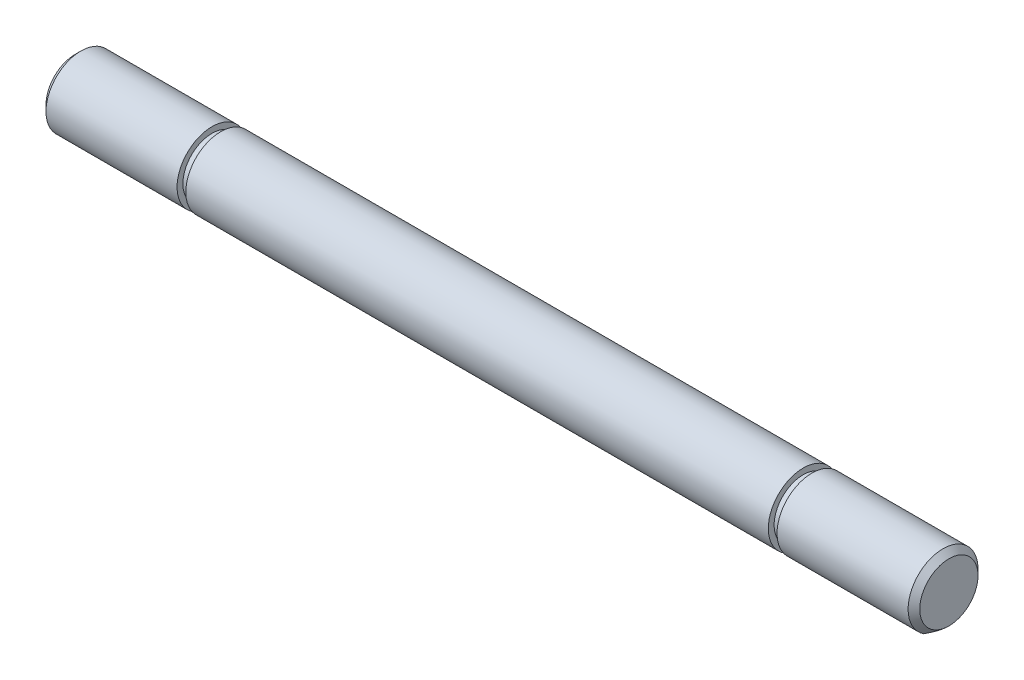
ISO-10303-21;
HEADER;
FILE_DESCRIPTION(('STEP AP214'),'2;1');
FILE_NAME('part.step','',(''),(''),'','','');
FILE_SCHEMA(('AUTOMOTIVE_DESIGN { 1 0 10303 214 1 1 1 1 }'));
ENDSEC;
DATA;
#1=APPLICATION_CONTEXT('core data for automotive mechanical design processes');
#2=APPLICATION_PROTOCOL_DEFINITION('international standard','automotive_design',2000,#1);
#3=PRODUCT_CONTEXT('',#1,'mechanical');
#4=PRODUCT('Part','Part','',(#3));
#5=PRODUCT_RELATED_PRODUCT_CATEGORY('part','',(#4));
#6=PRODUCT_DEFINITION_FORMATION('','',#4);
#7=PRODUCT_DEFINITION_CONTEXT('part definition',#1,'design');
#8=PRODUCT_DEFINITION('design','',#6,#7);
#9=PRODUCT_DEFINITION_SHAPE('','',#8);
#10=(LENGTH_UNIT() NAMED_UNIT(*) SI_UNIT(.MILLI.,.METRE.));
#11=(NAMED_UNIT(*) PLANE_ANGLE_UNIT() SI_UNIT($,.RADIAN.));
#12=(NAMED_UNIT(*) SI_UNIT($,.STERADIAN.) SOLID_ANGLE_UNIT());
#13=UNCERTAINTY_MEASURE_WITH_UNIT(LENGTH_MEASURE(1.E-05),#10,'distance_accuracy_value','');
#14=(GEOMETRIC_REPRESENTATION_CONTEXT(3) GLOBAL_UNCERTAINTY_ASSIGNED_CONTEXT((#13)) GLOBAL_UNIT_ASSIGNED_CONTEXT((#10,
#11,#12)) REPRESENTATION_CONTEXT('',''));
#15=CARTESIAN_POINT('',(0.,0.,0.));
#16=DIRECTION('',(0.,0.,1.));
#17=DIRECTION('',(1.,0.,0.));
#18=AXIS2_PLACEMENT_3D('',#15,#16,#17);
#19=CARTESIAN_POINT('',(75.,1.25000000000002,0.));
#20=DIRECTION('',(1.,0.,0.));
#21=DIRECTION('',(0.,0.,-1.));
#22=AXIS2_PLACEMENT_3D('',#19,#20,#21);
#23=PLANE('',#22);
#24=CARTESIAN_POINT('',(75.0000000001592,0.,0.));
#25=DIRECTION('',(-1.,0.,0.));
#26=DIRECTION('',(0.,0.,1.));
#27=AXIS2_PLACEMENT_3D('',#24,#25,#26);
#28=CIRCLE('',#27,2.50000000022508);
#29=CARTESIAN_POINT('',(75.0000000002717,-2.49999999999999,0.));
#30=VERTEX_POINT('',#29);
#31=EDGE_CURVE('E20',#30,#30,#28,.T.);
#32=ORIENTED_EDGE('',*,*,#31,.F.);
#33=EDGE_LOOP('',(#32));
#34=FACE_BOUND('',#33,.T.);
#35=ADVANCED_FACE('F17',(#34),#23,.T.);
#36=CARTESIAN_POINT('',(0.,1.25,0.));
#37=DIRECTION('',(-1.,0.,0.));
#38=DIRECTION('',(0.,0.,1.));
#39=AXIS2_PLACEMENT_3D('',#36,#37,#38);
#40=PLANE('',#39);
#41=CARTESIAN_POINT('',(-2.27373241762363E-10,0.,0.));
#42=DIRECTION('',(1.,0.,0.));
#43=DIRECTION('',(0.,1.,0.));
#44=AXIS2_PLACEMENT_3D('',#41,#42,#43);
#45=CIRCLE('',#44,2.5000000002251);
#46=CARTESIAN_POINT('',(-3.39924793578909E-10,-2.5,0.));
#47=VERTEX_POINT('',#46);
#48=EDGE_CURVE('E172',#47,#47,#45,.T.);
#49=ORIENTED_EDGE('',*,*,#48,.F.);
#50=EDGE_LOOP('',(#49));
#51=FACE_BOUND('',#50,.T.);
#52=ADVANCED_FACE('F287',(#51),#40,.T.);
#53=CARTESIAN_POINT('',(74.4999999997162,0.,0.));
#54=DIRECTION('',(-1.,0.,0.));
#55=DIRECTION('',(0.,0.,1.));
#56=AXIS2_PLACEMENT_3D('',#53,#54,#55);
#57=CONICAL_SURFACE('',#56,2.99999999981535,0.785398162544797);
#58=CARTESIAN_POINT('',(75.0000000003777,-2.49999999998421,0.));
#59=CARTESIAN_POINT('',(75.0000643180199,-2.49999999999433,-0.0768428390650394));
#60=CARTESIAN_POINT('',(74.9964585673021,-2.49999999999848,-0.153646619209573));
#61=CARTESIAN_POINT('',(74.9824138190233,-2.5000000000015,-0.306486913529822));
#62=CARTESIAN_POINT('',(74.9719877570996,-2.50000000000039,-0.382524604039087));
#63=CARTESIAN_POINT('',(74.9450231890718,-2.4999999999996,-0.532231200794343));
#64=CARTESIAN_POINT('',(74.9285851353344,-2.49999999999989,-0.605918542097343));
#65=CARTESIAN_POINT('',(74.8903277701731,-2.5000000000001,-0.751897161962571));
#66=CARTESIAN_POINT('',(74.8685063607689,-2.50000000000002,-0.824187884367823));
#67=CARTESIAN_POINT('',(74.822241707104,-2.49999999999997,-0.961361203300854));
#68=CARTESIAN_POINT('',(74.7981581625811,-2.49999999999999,-1.02636662471192));
#69=CARTESIAN_POINT('',(74.746697199588,-2.5,-1.1550556226088));
#70=CARTESIAN_POINT('',(74.7193196401627,-2.49999999999999,-1.21873914239197));
#71=CARTESIAN_POINT('',(74.6613450462086,-2.49999999999999,-1.34581350936637));
#72=CARTESIAN_POINT('',(74.6307045192634,-2.49999999999999,-1.40918435906754));
#73=CARTESIAN_POINT('',(74.5670350359512,-2.49999999999999,-1.5346611356597));
#74=CARTESIAN_POINT('',(74.5340077941687,-2.49999999999999,-1.59676793032073));
#75=CARTESIAN_POINT('',(74.4999999996368,-2.49999999999999,-1.65831239498743));
#76=B_SPLINE_CURVE_WITH_KNOTS('',3,(#58,#59,#60,#61,#62,#63,#64,#65,#66,#67,#68,#69,#70,#71,#72,
#73,#74,#75),.UNSPECIFIED.,.F.,.F.,(4,2,2,2,2,2,2,2,4),(0.,0.230381722368763,0.4603277567669,
0.686595218663642,0.912951000314749,1.1208193566158,1.32869661102922,1.53981070673847,
1.75077462031785),.UNSPECIFIED.);
#77=CARTESIAN_POINT('',(74.4999999998206,-2.49999999999999,-1.65831239507852));
#78=VERTEX_POINT('',#77);
#79=EDGE_CURVE('E73',#30,#78,#76,.T.);
#80=ORIENTED_EDGE('',*,*,#79,.T.);
#81=CARTESIAN_POINT('',(74.5,0.,0.));
#82=DIRECTION('',(1.,0.,0.));
#83=DIRECTION('',(0.,1.,0.));
#84=AXIS2_PLACEMENT_3D('',#81,#82,#83);
#85=CIRCLE('',#84,3.);
#86=CARTESIAN_POINT('',(74.4999999998206,-2.49999999999999,1.65831239507852));
#87=VERTEX_POINT('',#86);
#88=EDGE_CURVE('E78',#87,#78,#85,.F.);
#89=ORIENTED_EDGE('',*,*,#88,.F.);
#90=CARTESIAN_POINT('',(74.4999999996856,-2.5000000000998,1.6583123950039));
#91=CARTESIAN_POINT('',(74.5250200252538,-2.50000000003678,1.61304419057546));
#92=CARTESIAN_POINT('',(74.5494994268891,-2.50000000001007,1.56747781741814));
#93=CARTESIAN_POINT('',(74.5972096864187,-2.49999999998992,1.47571363155556));
#94=CARTESIAN_POINT('',(74.6204409035835,-2.49999999999648,1.42951600540109));
#95=CARTESIAN_POINT('',(74.6882337412242,-2.50000000000706,1.28946898271668));
#96=CARTESIAN_POINT('',(74.7306685532871,-2.50000000000186,1.19456817327001));
#97=CARTESIAN_POINT('',(74.8071641312183,-2.49999999999817,1.00435832712285));
#98=CARTESIAN_POINT('',(74.8414185931375,-2.49999999999951,0.909128167468527));
#99=CARTESIAN_POINT('',(74.901118638336,-2.50000000000048,0.715960997208867));
#100=CARTESIAN_POINT('',(74.9265705213433,-2.50000000000011,0.618025976817734));
#101=CARTESIAN_POINT('',(74.9639514163235,-2.49999999999989,0.43409653187828));
#102=CARTESIAN_POINT('',(74.9772928995877,-2.49999999999997,0.348395132601303));
#103=CARTESIAN_POINT('',(74.9908266546624,-2.5,0.218706233403878));
#104=CARTESIAN_POINT('',(74.9942588209172,-2.5,0.175042275234496));
#105=CARTESIAN_POINT('',(74.9988484551189,-2.49999999999999,0.0875881851967177));
#106=CARTESIAN_POINT('',(75.0000055505908,-2.49999999999998,0.0437980338430385));
#107=CARTESIAN_POINT('',(75.0000000003842,-2.49999999999999,1.32850111145839E-12));
#108=B_SPLINE_CURVE_WITH_KNOTS('',3,(#90,#91,#92,#93,#94,#95,#96,#97,#98,#99,#100,#101,#102,
#103,#104,#105,#106,#107),.UNSPECIFIED.,.F.,.F.,(4,2,2,2,2,2,2,2,4),(0.,0.155160114543342,
0.310275326718227,0.621889186997947,0.925164564596093,1.22822244625419,1.48798349608569,
1.61932602429203,1.75069005414115),.UNSPECIFIED.);
#109=EDGE_CURVE('E82',#87,#30,#108,.T.);
#110=ORIENTED_EDGE('',*,*,#109,.T.);
#111=ORIENTED_EDGE('',*,*,#31,.T.);
#112=EDGE_LOOP('',(#80,#89,#110,#111));
#113=FACE_BOUND('',#112,.T.);
#114=ADVANCED_FACE('F75',(#113),#57,.T.);
#115=CARTESIAN_POINT('',(64.75,-2.49999999999999,1.65831239517768));
#116=DIRECTION('',(0.,1.,0.));
#117=DIRECTION('',(0.,0.,1.));
#118=AXIS2_PLACEMENT_3D('',#115,#116,#117);
#119=PLANE('',#118);
#120=DIRECTION('',(1.,0.,0.));
#121=VECTOR('',#120,1.);
#122=CARTESIAN_POINT('',(68.875,-2.49999999999999,1.65831239517768));
#123=LINE('',#122,#121);
#124=CARTESIAN_POINT('',(64.75,-2.49999999999999,1.65831239517768));
#125=VERTEX_POINT('',#124);
#126=EDGE_CURVE('E94',#125,#87,#123,.T.);
#127=ORIENTED_EDGE('',*,*,#126,.F.);
#128=DIRECTION('',(0.,0.,-1.));
#129=VECTOR('',#128,1.);
#130=CARTESIAN_POINT('',(64.75,-2.49999999999999,0.));
#131=LINE('',#130,#129);
#132=CARTESIAN_POINT('',(64.75,-2.49999999999999,-1.65831239517768));
#133=VERTEX_POINT('',#132);
#134=EDGE_CURVE('E87',#133,#125,#131,.F.);
#135=ORIENTED_EDGE('',*,*,#134,.F.);
#136=DIRECTION('',(1.,0.,0.));
#137=VECTOR('',#136,1.);
#138=CARTESIAN_POINT('',(68.875,-2.49999999999999,-1.65831239517768));
#139=LINE('',#138,#137);
#140=EDGE_CURVE('E84',#78,#133,#139,.F.);
#141=ORIENTED_EDGE('',*,*,#140,.F.);
#142=ORIENTED_EDGE('',*,*,#79,.F.);
#143=ORIENTED_EDGE('',*,*,#109,.F.);
#144=EDGE_LOOP('',(#127,#135,#141,#142,#143));
#145=FACE_BOUND('',#144,.T.);
#146=ADVANCED_FACE('F85',(#145),#119,.F.);
#147=CARTESIAN_POINT('',(64.75,-2.65347891346476,0.));
#148=DIRECTION('',(1.,0.,0.));
#149=DIRECTION('',(0.,0.,-1.));
#150=AXIS2_PLACEMENT_3D('',#147,#148,#149);
#151=PLANE('',#150);
#152=ORIENTED_EDGE('',*,*,#134,.T.);
#153=CARTESIAN_POINT('',(64.75,0.,0.));
#154=DIRECTION('',(1.,0.,0.));
#155=DIRECTION('',(0.,1.,0.));
#156=AXIS2_PLACEMENT_3D('',#153,#154,#155);
#157=CIRCLE('',#156,3.);
#158=EDGE_CURVE('E91',#133,#125,#157,.F.);
#159=ORIENTED_EDGE('',*,*,#158,.F.);
#160=EDGE_LOOP('',(#152,#159));
#161=FACE_BOUND('',#160,.T.);
#162=ADVANCED_FACE('F154',(#161),#151,.T.);
#163=CARTESIAN_POINT('',(0.500000000158708,0.,0.));
#164=DIRECTION('',(1.,0.,0.));
#165=DIRECTION('',(0.,1.,0.));
#166=AXIS2_PLACEMENT_3D('',#163,#164,#165);
#167=CONICAL_SURFACE('',#166,2.99999999970169,0.785398162487953);
#168=CARTESIAN_POINT('',(-4.42714658253282E-10,-2.49999999997643,0.));
#169=CARTESIAN_POINT('',(-6.43180869622326E-05,-2.49999999999154,0.0768428390574871));
#170=CARTESIAN_POINT('',(0.00354143262968951,-2.49999999999773,0.153646619194417));
#171=CARTESIAN_POINT('',(0.0175861809067086,-2.50000000000225,0.306486913499419));
#172=CARTESIAN_POINT('',(0.0280122428296728,-2.5000000000006,0.382524604001039));
#173=CARTESIAN_POINT('',(0.0549768108553982,-2.4999999999994,0.532231200741025));
#174=CARTESIAN_POINT('',(0.0714148645913386,-2.49999999999984,0.605918542036402));
#175=CARTESIAN_POINT('',(0.109672229749392,-2.50000000000015,0.751897161886475));
#176=CARTESIAN_POINT('',(0.131493639151768,-2.50000000000004,0.824187884284196));
#177=CARTESIAN_POINT('',(0.177758292818269,-2.49999999999996,0.961361203218611));
#178=CARTESIAN_POINT('',(0.201841837345438,-2.49999999999999,1.02636662463827));
#179=CARTESIAN_POINT('',(0.253302800348481,-2.50000000000001,1.15505562255175));
#180=CARTESIAN_POINT('',(0.280680359779371,-2.5,1.21873914234292));
#181=CARTESIAN_POINT('',(0.338654953745804,-2.49999999999999,1.34581350933328));
#182=CARTESIAN_POINT('',(0.369295480697829,-2.49999999999999,1.40918435904239));
#183=CARTESIAN_POINT('',(0.432964964024455,-2.5,1.53466113564985));
#184=CARTESIAN_POINT('',(0.465992205814622,-2.5,1.59676793031824));
#185=CARTESIAN_POINT('',(0.500000000354411,-2.5,1.65831239499208));
#186=B_SPLINE_CURVE_WITH_KNOTS('',3,(#168,#169,#170,#171,#172,#173,#174,#175,#176,#177,#178,
#179,#180,#181,#182,#183,#184,#185),.UNSPECIFIED.,.F.,.F.,(4,2,2,2,2,2,2,2,4),(0.,
0.230381722345836,0.460327756720946,0.686595218594446,0.912951000222368,1.12081935655201,
1.32869661099407,1.53981070673365,1.75077462034321),.UNSPECIFIED.);
#187=CARTESIAN_POINT('',(0.500000000175033,-2.5,1.65831239508096));
#188=VERTEX_POINT('',#187);
#189=EDGE_CURVE('E142',#47,#188,#186,.T.);
#190=ORIENTED_EDGE('',*,*,#189,.T.);
#191=CARTESIAN_POINT('',(0.500000000000004,0.,0.));
#192=DIRECTION('',(1.,0.,0.));
#193=DIRECTION('',(0.,1.,0.));
#194=AXIS2_PLACEMENT_3D('',#191,#192,#193);
#195=CIRCLE('',#194,3.);
#196=CARTESIAN_POINT('',(0.500000000175033,-2.5,-1.65831239508096));
#197=VERTEX_POINT('',#196);
#198=EDGE_CURVE('E177',#197,#188,#195,.T.);
#199=ORIENTED_EDGE('',*,*,#198,.F.);
#200=CARTESIAN_POINT('',(0.500000000306733,-2.50000000009738,-1.65831239500816));
#201=CARTESIAN_POINT('',(0.474979974736805,-2.50000000003588,-1.6130441905833));
#202=CARTESIAN_POINT('',(0.450500573099985,-2.50000000000982,-1.56747781742935));
#203=CARTESIAN_POINT('',(0.402790313567777,-2.49999999999017,-1.47571363157329));
#204=CARTESIAN_POINT('',(0.379559096401743,-2.49999999999656,-1.42951600542198));
#205=CARTESIAN_POINT('',(0.311766258757242,-2.50000000000689,-1.28946898274708));
#206=CARTESIAN_POINT('',(0.269331446691353,-2.50000000000182,-1.19456817330677));
#207=CARTESIAN_POINT('',(0.192835868753987,-2.49999999999822,-1.00435832717222));
#208=CARTESIAN_POINT('',(0.158581406831563,-2.49999999999952,-0.909128167524154));
#209=CARTESIAN_POINT('',(0.0988813616259071,-2.50000000000047,-0.715960997276717));
#210=CARTESIAN_POINT('',(0.0734294786147151,-2.50000000000011,-0.618025976891546));
#211=CARTESIAN_POINT('',(0.0360485836235124,-2.4999999999999,-0.43409653194562));
#212=CARTESIAN_POINT('',(0.0227071003537242,-2.49999999999998,-0.348395132655952));
#213=CARTESIAN_POINT('',(0.00917334527335276,-2.50000000000001,-0.218706233438818));
#214=CARTESIAN_POINT('',(0.00574117901709174,-2.5,-0.175042275262638));
#215=CARTESIAN_POINT('',(0.00115154481331919,-2.49999999999999,-0.087588185211168));
#216=CARTESIAN_POINT('',(-5.55065901399899E-06,-2.49999999999999,-0.043798033850595));
#217=CARTESIAN_POINT('',(-4.5247697784672E-10,-2.5,-1.98434788272478E-12));
#218=B_SPLINE_CURVE_WITH_KNOTS('',3,(#200,#201,#202,#203,#204,#205,#206,#207,#208,#209,#210,
#211,#212,#213,#214,#215,#216,#217),.UNSPECIFIED.,.F.,.F.,(4,2,2,2,2,2,2,2,4),(0.,
0.155160114536501,0.31027532670452,0.62188918697047,0.925164564554251,1.228222446198,
1.48798349606939,1.61932602429637,1.75069005416617),.UNSPECIFIED.);
#219=EDGE_CURVE('E134',#197,#47,#218,.T.);
#220=ORIENTED_EDGE('',*,*,#219,.T.);
#221=ORIENTED_EDGE('',*,*,#48,.T.);
#222=EDGE_LOOP('',(#190,#199,#220,#221));
#223=FACE_BOUND('',#222,.T.);
#224=ADVANCED_FACE('F150',(#223),#167,.T.);
#225=CARTESIAN_POINT('',(10.25,-2.5,-1.65831239517771));
#226=DIRECTION('',(0.,1.,0.));
#227=DIRECTION('',(0.,0.,1.));
#228=AXIS2_PLACEMENT_3D('',#225,#226,#227);
#229=PLANE('',#228);
#230=DIRECTION('',(1.,0.,0.));
#231=VECTOR('',#230,1.);
#232=CARTESIAN_POINT('',(6.125,-2.5,-1.65831239517771));
#233=LINE('',#232,#231);
#234=CARTESIAN_POINT('',(10.25,-2.5,-1.65831239517771));
#235=VERTEX_POINT('',#234);
#236=EDGE_CURVE('E133',#235,#197,#233,.F.);
#237=ORIENTED_EDGE('',*,*,#236,.F.);
#238=DIRECTION('',(0.,0.,-1.));
#239=VECTOR('',#238,1.);
#240=CARTESIAN_POINT('',(10.25,-2.5,0.));
#241=LINE('',#240,#239);
#242=CARTESIAN_POINT('',(10.25,-2.5,1.65831239517771));
#243=VERTEX_POINT('',#242);
#244=EDGE_CURVE('E96',#235,#243,#241,.F.);
#245=ORIENTED_EDGE('',*,*,#244,.T.);
#246=DIRECTION('',(1.,0.,0.));
#247=VECTOR('',#246,1.);
#248=CARTESIAN_POINT('',(6.125,-2.5,1.65831239517771));
#249=LINE('',#248,#247);
#250=EDGE_CURVE('E131',#188,#243,#249,.T.);
#251=ORIENTED_EDGE('',*,*,#250,.F.);
#252=ORIENTED_EDGE('',*,*,#189,.F.);
#253=ORIENTED_EDGE('',*,*,#219,.F.);
#254=EDGE_LOOP('',(#237,#245,#251,#252,#253));
#255=FACE_BOUND('',#254,.T.);
#256=ADVANCED_FACE('F147',(#255),#229,.F.);
#257=CARTESIAN_POINT('',(10.25,-2.65347891346476,0.));
#258=DIRECTION('',(1.,0.,0.));
#259=DIRECTION('',(0.,0.,-1.));
#260=AXIS2_PLACEMENT_3D('',#257,#258,#259);
#261=PLANE('',#260);
#262=CARTESIAN_POINT('',(10.25,0.,0.));
#263=DIRECTION('',(1.,0.,0.));
#264=DIRECTION('',(0.,1.,0.));
#265=AXIS2_PLACEMENT_3D('',#262,#263,#264);
#266=CIRCLE('',#265,3.);
#267=EDGE_CURVE('E128',#243,#235,#266,.T.);
#268=ORIENTED_EDGE('',*,*,#267,.F.);
#269=ORIENTED_EDGE('',*,*,#244,.F.);
#270=EDGE_LOOP('',(#268,#269));
#271=FACE_BOUND('',#270,.T.);
#272=ADVANCED_FACE('F252',(#271),#261,.F.);
#273=CARTESIAN_POINT('',(68.875,0.,0.));
#274=DIRECTION('',(1.,0.,0.));
#275=DIRECTION('',(0.,1.,0.));
#276=AXIS2_PLACEMENT_3D('',#273,#274,#275);
#277=CYLINDRICAL_SURFACE('',#276,3.);
#278=CARTESIAN_POINT('',(63.25,0.,0.));
#279=DIRECTION('',(1.,0.,0.));
#280=DIRECTION('',(0.,1.,0.));
#281=AXIS2_PLACEMENT_3D('',#278,#279,#280);
#282=CIRCLE('',#281,3.);
#283=CARTESIAN_POINT('',(63.25,3.00000000000001,0.));
#284=VERTEX_POINT('',#283);
#285=EDGE_CURVE('E125',#284,#284,#282,.F.);
#286=ORIENTED_EDGE('',*,*,#285,.F.);
#287=EDGE_LOOP('',(#286));
#288=FACE_BOUND('',#287,.T.);
#289=ORIENTED_EDGE('',*,*,#140,.T.);
#290=ORIENTED_EDGE('',*,*,#158,.T.);
#291=ORIENTED_EDGE('',*,*,#126,.T.);
#292=ORIENTED_EDGE('',*,*,#88,.T.);
#293=EDGE_LOOP('',(#289,#290,#291,#292));
#294=FACE_BOUND('',#293,.T.);
#295=ADVANCED_FACE('F93',(#288,#294),#277,.T.);
#296=CARTESIAN_POINT('',(6.125,0.,0.));
#297=DIRECTION('',(1.,0.,0.));
#298=DIRECTION('',(0.,1.,0.));
#299=AXIS2_PLACEMENT_3D('',#296,#297,#298);
#300=CYLINDRICAL_SURFACE('',#299,3.);
#301=CARTESIAN_POINT('',(11.75,0.,0.));
#302=DIRECTION('',(1.,0.,0.));
#303=DIRECTION('',(0.,1.,0.));
#304=AXIS2_PLACEMENT_3D('',#301,#302,#303);
#305=CIRCLE('',#304,3.);
#306=CARTESIAN_POINT('',(11.75,3.00000000000001,0.));
#307=VERTEX_POINT('',#306);
#308=EDGE_CURVE('E122',#307,#307,#305,.T.);
#309=ORIENTED_EDGE('',*,*,#308,.F.);
#310=EDGE_LOOP('',(#309));
#311=FACE_BOUND('',#310,.T.);
#312=ORIENTED_EDGE('',*,*,#250,.T.);
#313=ORIENTED_EDGE('',*,*,#267,.T.);
#314=ORIENTED_EDGE('',*,*,#236,.T.);
#315=ORIENTED_EDGE('',*,*,#198,.T.);
#316=EDGE_LOOP('',(#312,#313,#314,#315));
#317=FACE_BOUND('',#316,.T.);
#318=ADVANCED_FACE('F246',(#311,#317),#300,.T.);
#319=CARTESIAN_POINT('',(63.25,2.75000000000001,0.));
#320=DIRECTION('',(-1.,0.,0.));
#321=DIRECTION('',(0.,0.,1.));
#322=AXIS2_PLACEMENT_3D('',#319,#320,#321);
#323=PLANE('',#322);
#324=CARTESIAN_POINT('',(63.25,0.,0.));
#325=DIRECTION('',(1.,0.,0.));
#326=DIRECTION('',(0.,1.,0.));
#327=AXIS2_PLACEMENT_3D('',#324,#325,#326);
#328=CIRCLE('',#327,2.5);
#329=CARTESIAN_POINT('',(63.25,2.50000000000002,0.));
#330=VERTEX_POINT('',#329);
#331=EDGE_CURVE('E119',#330,#330,#328,.F.);
#332=ORIENTED_EDGE('',*,*,#331,.F.);
#333=EDGE_LOOP('',(#332));
#334=FACE_BOUND('',#333,.T.);
#335=ORIENTED_EDGE('',*,*,#285,.T.);
#336=EDGE_LOOP('',(#335));
#337=FACE_BOUND('',#336,.T.);
#338=ADVANCED_FACE('F242',(#334,#337),#323,.T.);
#339=CARTESIAN_POINT('',(11.75,2.75,0.));
#340=DIRECTION('',(1.,0.,0.));
#341=DIRECTION('',(0.,0.,-1.));
#342=AXIS2_PLACEMENT_3D('',#339,#340,#341);
#343=PLANE('',#342);
#344=CARTESIAN_POINT('',(11.75,0.,0.));
#345=DIRECTION('',(1.,0.,0.));
#346=DIRECTION('',(0.,1.,0.));
#347=AXIS2_PLACEMENT_3D('',#344,#345,#346);
#348=CIRCLE('',#347,2.5);
#349=CARTESIAN_POINT('',(11.75,2.5,0.));
#350=VERTEX_POINT('',#349);
#351=EDGE_CURVE('E116',#350,#350,#348,.T.);
#352=ORIENTED_EDGE('',*,*,#351,.F.);
#353=EDGE_LOOP('',(#352));
#354=FACE_BOUND('',#353,.T.);
#355=ORIENTED_EDGE('',*,*,#308,.T.);
#356=EDGE_LOOP('',(#355));
#357=FACE_BOUND('',#356,.T.);
#358=ADVANCED_FACE('F236',(#354,#357),#343,.T.);
#359=CARTESIAN_POINT('',(62.875,0.,0.));
#360=DIRECTION('',(1.,0.,0.));
#361=DIRECTION('',(0.,1.,0.));
#362=AXIS2_PLACEMENT_3D('',#359,#360,#361);
#363=CYLINDRICAL_SURFACE('',#362,2.5);
#364=CARTESIAN_POINT('',(62.5,0.,0.));
#365=DIRECTION('',(1.,0.,0.));
#366=DIRECTION('',(0.,1.,0.));
#367=AXIS2_PLACEMENT_3D('',#364,#365,#366);
#368=CIRCLE('',#367,2.5);
#369=CARTESIAN_POINT('',(62.5,2.50000000000002,0.));
#370=VERTEX_POINT('',#369);
#371=EDGE_CURVE('E112',#370,#370,#368,.F.);
#372=ORIENTED_EDGE('',*,*,#371,.F.);
#373=EDGE_LOOP('',(#372));
#374=FACE_BOUND('',#373,.T.);
#375=ORIENTED_EDGE('',*,*,#331,.T.);
#376=EDGE_LOOP('',(#375));
#377=FACE_BOUND('',#376,.T.);
#378=ADVANCED_FACE('F227',(#374,#377),#363,.T.);
#379=CARTESIAN_POINT('',(12.125,0.,0.));
#380=DIRECTION('',(1.,0.,0.));
#381=DIRECTION('',(0.,1.,0.));
#382=AXIS2_PLACEMENT_3D('',#379,#380,#381);
#383=CYLINDRICAL_SURFACE('',#382,2.5);
#384=ORIENTED_EDGE('',*,*,#351,.T.);
#385=EDGE_LOOP('',(#384));
#386=FACE_BOUND('',#385,.T.);
#387=CARTESIAN_POINT('',(12.5,0.,0.));
#388=DIRECTION('',(1.,0.,0.));
#389=DIRECTION('',(0.,1.,0.));
#390=AXIS2_PLACEMENT_3D('',#387,#388,#389);
#391=CIRCLE('',#390,2.5);
#392=CARTESIAN_POINT('',(12.5,2.5,0.));
#393=VERTEX_POINT('',#392);
#394=EDGE_CURVE('E109',#393,#393,#391,.T.);
#395=ORIENTED_EDGE('',*,*,#394,.F.);
#396=EDGE_LOOP('',(#395));
#397=FACE_BOUND('',#396,.T.);
#398=ADVANCED_FACE('F225',(#386,#397),#383,.T.);
#399=CARTESIAN_POINT('',(62.5,2.75000000000001,0.));
#400=DIRECTION('',(1.,0.,0.));
#401=DIRECTION('',(0.,0.,-1.));
#402=AXIS2_PLACEMENT_3D('',#399,#400,#401);
#403=PLANE('',#402);
#404=ORIENTED_EDGE('',*,*,#371,.T.);
#405=EDGE_LOOP('',(#404));
#406=FACE_BOUND('',#405,.T.);
#407=CARTESIAN_POINT('',(62.5,0.,0.));
#408=DIRECTION('',(1.,0.,0.));
#409=DIRECTION('',(0.,1.,0.));
#410=AXIS2_PLACEMENT_3D('',#407,#408,#409);
#411=CIRCLE('',#410,3.);
#412=CARTESIAN_POINT('',(62.5,3.00000000000001,0.));
#413=VERTEX_POINT('',#412);
#414=EDGE_CURVE('E106',#413,#413,#411,.F.);
#415=ORIENTED_EDGE('',*,*,#414,.F.);
#416=EDGE_LOOP('',(#415));
#417=FACE_BOUND('',#416,.T.);
#418=ADVANCED_FACE('F208',(#406,#417),#403,.T.);
#419=CARTESIAN_POINT('',(34.5,-2.65347891346476,0.));
#420=DIRECTION('',(1.,0.,0.));
#421=DIRECTION('',(0.,0.,-1.));
#422=AXIS2_PLACEMENT_3D('',#419,#420,#421);
#423=PLANE('',#422);
#424=DIRECTION('',(0.,0.,1.));
#425=VECTOR('',#424,1.);
#426=CARTESIAN_POINT('',(34.5,-2.5,1.65831239517768));
#427=LINE('',#426,#425);
#428=CARTESIAN_POINT('',(34.5,-2.5,-1.65831239517768));
#429=VERTEX_POINT('',#428);
#430=CARTESIAN_POINT('',(34.5,-2.5,1.65831239517768));
#431=VERTEX_POINT('',#430);
#432=EDGE_CURVE('E115',#429,#431,#427,.T.);
#433=ORIENTED_EDGE('',*,*,#432,.T.);
#434=CARTESIAN_POINT('',(34.5,0.,0.));
#435=DIRECTION('',(1.,0.,0.));
#436=DIRECTION('',(0.,1.,0.));
#437=AXIS2_PLACEMENT_3D('',#434,#435,#436);
#438=CIRCLE('',#437,3.);
#439=EDGE_CURVE('E103',#429,#431,#438,.F.);
#440=ORIENTED_EDGE('',*,*,#439,.F.);
#441=EDGE_LOOP('',(#433,#440));
#442=FACE_BOUND('',#441,.T.);
#443=ADVANCED_FACE('F199',(#442),#423,.T.);
#444=CARTESIAN_POINT('',(40.5,-2.65347891346476,0.));
#445=DIRECTION('',(1.,0.,0.));
#446=DIRECTION('',(0.,0.,-1.));
#447=AXIS2_PLACEMENT_3D('',#444,#445,#446);
#448=PLANE('',#447);
#449=CARTESIAN_POINT('',(40.5,0.,0.));
#450=DIRECTION('',(1.,0.,0.));
#451=DIRECTION('',(0.,1.,0.));
#452=AXIS2_PLACEMENT_3D('',#449,#450,#451);
#453=CIRCLE('',#452,3.);
#454=CARTESIAN_POINT('',(40.5,-2.5,1.65831239517768));
#455=VERTEX_POINT('',#454);
#456=CARTESIAN_POINT('',(40.5,-2.5,-1.65831239517768));
#457=VERTEX_POINT('',#456);
#458=EDGE_CURVE('E99',#455,#457,#453,.T.);
#459=ORIENTED_EDGE('',*,*,#458,.F.);
#460=DIRECTION('',(0.,0.,1.));
#461=VECTOR('',#460,1.);
#462=CARTESIAN_POINT('',(40.5,-2.5,1.65831239517768));
#463=LINE('',#462,#461);
#464=EDGE_CURVE('E34',#455,#457,#463,.F.);
#465=ORIENTED_EDGE('',*,*,#464,.T.);
#466=EDGE_LOOP('',(#459,#465));
#467=FACE_BOUND('',#466,.T.);
#468=ADVANCED_FACE('F197',(#467),#448,.F.);
#469=CARTESIAN_POINT('',(37.5,-2.5,1.65831239517768));
#470=DIRECTION('',(0.,1.,0.));
#471=DIRECTION('',(0.,0.,1.));
#472=AXIS2_PLACEMENT_3D('',#469,#470,#471);
#473=PLANE('',#472);
#474=DIRECTION('',(1.,0.,0.));
#475=VECTOR('',#474,1.);
#476=CARTESIAN_POINT('',(37.5,-2.5,1.65831239517768));
#477=LINE('',#476,#475);
#478=EDGE_CURVE('E102',#431,#455,#477,.T.);
#479=ORIENTED_EDGE('',*,*,#478,.F.);
#480=ORIENTED_EDGE('',*,*,#432,.F.);
#481=DIRECTION('',(1.,0.,0.));
#482=VECTOR('',#481,1.);
#483=CARTESIAN_POINT('',(37.5,-2.5,-1.65831239517768));
#484=LINE('',#483,#482);
#485=EDGE_CURVE('E26',#457,#429,#484,.F.);
#486=ORIENTED_EDGE('',*,*,#485,.F.);
#487=ORIENTED_EDGE('',*,*,#464,.F.);
#488=EDGE_LOOP('',(#479,#480,#486,#487));
#489=FACE_BOUND('',#488,.T.);
#490=ADVANCED_FACE('F196',(#489),#473,.F.);
#491=CARTESIAN_POINT('',(12.5,2.75,0.));
#492=DIRECTION('',(-1.,0.,0.));
#493=DIRECTION('',(0.,0.,1.));
#494=AXIS2_PLACEMENT_3D('',#491,#492,#493);
#495=PLANE('',#494);
#496=ORIENTED_EDGE('',*,*,#394,.T.);
#497=EDGE_LOOP('',(#496));
#498=FACE_BOUND('',#497,.T.);
#499=CARTESIAN_POINT('',(12.5,0.,0.));
#500=DIRECTION('',(1.,0.,0.));
#501=DIRECTION('',(0.,1.,0.));
#502=AXIS2_PLACEMENT_3D('',#499,#500,#501);
#503=CIRCLE('',#502,3.);
#504=CARTESIAN_POINT('',(12.5,3.,0.));
#505=VERTEX_POINT('',#504);
#506=EDGE_CURVE('E11',#505,#505,#503,.T.);
#507=ORIENTED_EDGE('',*,*,#506,.F.);
#508=EDGE_LOOP('',(#507));
#509=FACE_BOUND('',#508,.T.);
#510=ADVANCED_FACE('F206',(#498,#509),#495,.T.);
#511=CARTESIAN_POINT('',(37.5,0.,0.));
#512=DIRECTION('',(1.,0.,0.));
#513=DIRECTION('',(0.,1.,0.));
#514=AXIS2_PLACEMENT_3D('',#511,#512,#513);
#515=CYLINDRICAL_SURFACE('',#514,3.);
#516=ORIENTED_EDGE('',*,*,#506,.T.);
#517=EDGE_LOOP('',(#516));
#518=FACE_BOUND('',#517,.T.);
#519=ORIENTED_EDGE('',*,*,#458,.T.);
#520=ORIENTED_EDGE('',*,*,#485,.T.);
#521=ORIENTED_EDGE('',*,*,#439,.T.);
#522=ORIENTED_EDGE('',*,*,#478,.T.);
#523=EDGE_LOOP('',(#519,#520,#521,#522));
#524=FACE_BOUND('',#523,.T.);
#525=ORIENTED_EDGE('',*,*,#414,.T.);
#526=EDGE_LOOP('',(#525));
#527=FACE_BOUND('',#526,.T.);
#528=ADVANCED_FACE('F192',(#518,#524,#527),#515,.T.);
#529=CLOSED_SHELL('',(#35,#52,#114,#146,#162,#224,#256,#272,#295,#318,#338,#358,#378,#398,#418,
#443,#468,#490,#510,#528));
#530=MANIFOLD_SOLID_BREP('B1',#529);
#531=ADVANCED_BREP_SHAPE_REPRESENTATION('',(#18,#530),#14);
#532=SHAPE_DEFINITION_REPRESENTATION(#9,#531);
ENDSEC;
END-ISO-10303-21;
